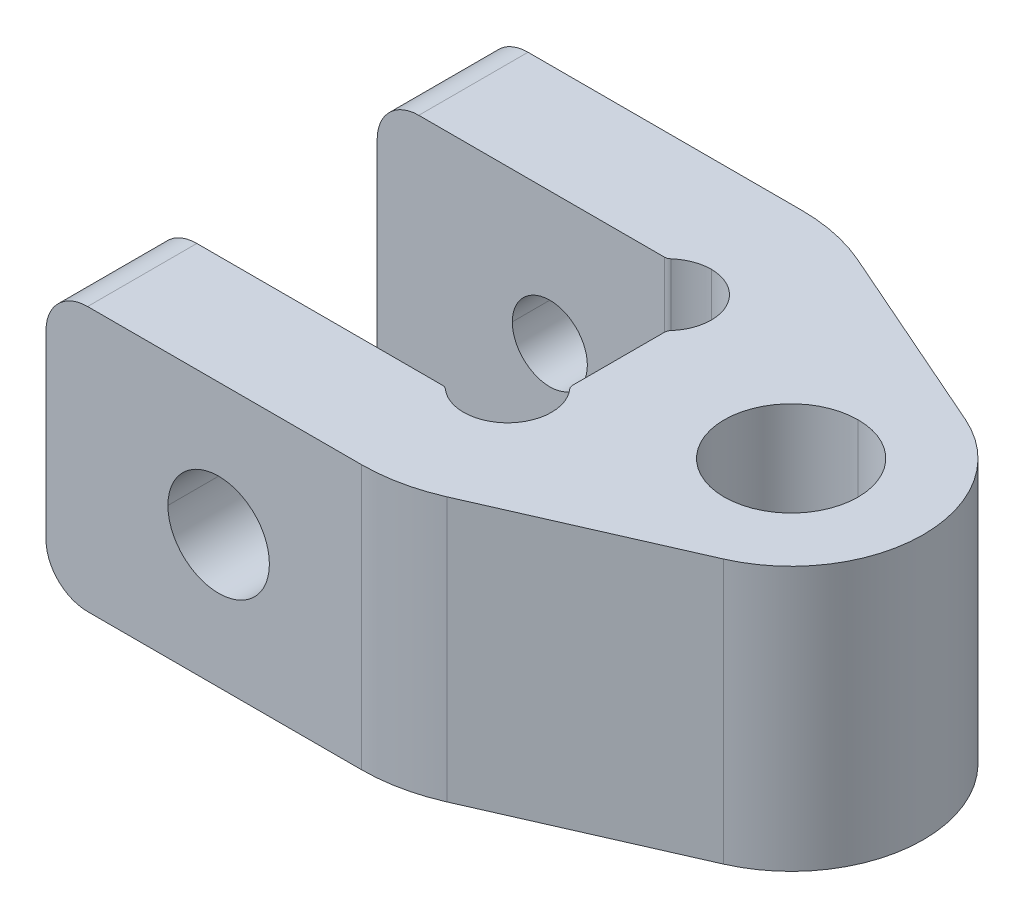
ISO-10303-21;
HEADER;
FILE_DESCRIPTION(('STEP AP214'),'2;1');
FILE_NAME('part.step','',(''),(''),'','','');
FILE_SCHEMA(('AUTOMOTIVE_DESIGN { 1 0 10303 214 1 1 1 1 }'));
ENDSEC;
DATA;
#1=APPLICATION_CONTEXT('core data for automotive mechanical design processes');
#2=APPLICATION_PROTOCOL_DEFINITION('international standard','automotive_design',2000,#1);
#3=PRODUCT_CONTEXT('',#1,'mechanical');
#4=PRODUCT('Part','Part','',(#3));
#5=PRODUCT_RELATED_PRODUCT_CATEGORY('part','',(#4));
#6=PRODUCT_DEFINITION_FORMATION('','',#4);
#7=PRODUCT_DEFINITION_CONTEXT('part definition',#1,'design');
#8=PRODUCT_DEFINITION('design','',#6,#7);
#9=PRODUCT_DEFINITION_SHAPE('','',#8);
#10=(LENGTH_UNIT() NAMED_UNIT(*) SI_UNIT(.MILLI.,.METRE.));
#11=(NAMED_UNIT(*) PLANE_ANGLE_UNIT() SI_UNIT($,.RADIAN.));
#12=(NAMED_UNIT(*) SI_UNIT($,.STERADIAN.) SOLID_ANGLE_UNIT());
#13=UNCERTAINTY_MEASURE_WITH_UNIT(LENGTH_MEASURE(1.E-05),#10,'distance_accuracy_value','');
#14=(GEOMETRIC_REPRESENTATION_CONTEXT(3) GLOBAL_UNCERTAINTY_ASSIGNED_CONTEXT((#13)) GLOBAL_UNIT_ASSIGNED_CONTEXT((#10,
#11,#12)) REPRESENTATION_CONTEXT('',''));
#15=CARTESIAN_POINT('',(0.,0.,0.));
#16=DIRECTION('',(0.,0.,1.));
#17=DIRECTION('',(1.,0.,0.));
#18=AXIS2_PLACEMENT_3D('',#15,#16,#17);
#19=CARTESIAN_POINT('',(0.,0.,-7.9385));
#20=DIRECTION('',(0.,0.,1.));
#21=DIRECTION('',(1.,0.,0.));
#22=AXIS2_PLACEMENT_3D('',#19,#20,#21);
#23=CYLINDRICAL_SURFACE('',#22,1.8288);
#24=DIRECTION('',(0.,0.,1.));
#25=VECTOR('',#24,1.);
#26=CARTESIAN_POINT('',(-1.8288,0.,-7.9385));
#27=LINE('',#26,#25);
#28=CARTESIAN_POINT('',(-1.8288,0.,4.0005));
#29=VERTEX_POINT('',#28);
#30=CARTESIAN_POINT('',(-1.8288,0.,7.9375));
#31=VERTEX_POINT('',#30);
#32=EDGE_CURVE('E319',#29,#31,#27,.T.);
#33=ORIENTED_EDGE('',*,*,#32,.F.);
#34=CARTESIAN_POINT('',(0.,0.,4.0005));
#35=DIRECTION('',(0.,0.,-1.));
#36=DIRECTION('',(1.,0.,0.));
#37=AXIS2_PLACEMENT_3D('',#34,#35,#36);
#38=CIRCLE('',#37,1.8288);
#39=CARTESIAN_POINT('',(1.8288,0.,4.0005));
#40=VERTEX_POINT('',#39);
#41=EDGE_CURVE('E282',#29,#40,#38,.T.);
#42=ORIENTED_EDGE('',*,*,#41,.T.);
#43=DIRECTION('',(0.,0.,1.));
#44=VECTOR('',#43,1.);
#45=CARTESIAN_POINT('',(1.8288,0.,-7.9385));
#46=LINE('',#45,#44);
#47=CARTESIAN_POINT('',(1.8288,0.,7.9375));
#48=VERTEX_POINT('',#47);
#49=EDGE_CURVE('E308',#40,#48,#46,.T.);
#50=ORIENTED_EDGE('',*,*,#49,.T.);
#51=CARTESIAN_POINT('',(0.,0.,7.9375));
#52=DIRECTION('',(0.,0.,1.));
#53=DIRECTION('',(1.,0.,0.));
#54=AXIS2_PLACEMENT_3D('',#51,#52,#53);
#55=CIRCLE('',#54,1.8288);
#56=EDGE_CURVE('E366',#48,#31,#55,.T.);
#57=ORIENTED_EDGE('',*,*,#56,.T.);
#58=EDGE_LOOP('',(#33,#42,#50,#57));
#59=FACE_BOUND('',#58,.T.);
#60=ADVANCED_FACE('F16',(#59),#23,.F.);
#61=CARTESIAN_POINT('',(0.,0.,-7.9375));
#62=DIRECTION('',(0.,0.,-1.));
#63=DIRECTION('',(-1.,0.,0.));
#64=AXIS2_PLACEMENT_3D('',#61,#62,#63);
#65=CYLINDRICAL_SURFACE('',#64,1.35255);
#66=DIRECTION('',(0.,0.,-1.));
#67=VECTOR('',#66,1.);
#68=CARTESIAN_POINT('',(1.35255,0.,-7.9375));
#69=LINE('',#68,#67);
#70=CARTESIAN_POINT('',(1.35255,0.,-4.0005));
#71=VERTEX_POINT('',#70);
#72=CARTESIAN_POINT('',(1.35255,0.,-7.9375));
#73=VERTEX_POINT('',#72);
#74=EDGE_CURVE('E307',#71,#73,#69,.T.);
#75=ORIENTED_EDGE('',*,*,#74,.F.);
#76=CARTESIAN_POINT('',(0.,0.,-4.0005));
#77=DIRECTION('',(0.,0.,-1.));
#78=DIRECTION('',(-1.,0.,0.));
#79=AXIS2_PLACEMENT_3D('',#76,#77,#78);
#80=CIRCLE('',#79,1.35255);
#81=CARTESIAN_POINT('',(-1.35255,0.,-4.0005));
#82=VERTEX_POINT('',#81);
#83=EDGE_CURVE('E372',#82,#71,#80,.T.);
#84=ORIENTED_EDGE('',*,*,#83,.F.);
#85=DIRECTION('',(0.,0.,-1.));
#86=VECTOR('',#85,1.);
#87=CARTESIAN_POINT('',(-1.35255,0.,-7.9375));
#88=LINE('',#87,#86);
#89=CARTESIAN_POINT('',(-1.35255,0.,-7.9375));
#90=VERTEX_POINT('',#89);
#91=EDGE_CURVE('E371',#82,#90,#88,.T.);
#92=ORIENTED_EDGE('',*,*,#91,.T.);
#93=CARTESIAN_POINT('',(0.,0.,-7.9375));
#94=DIRECTION('',(0.,0.,-1.));
#95=DIRECTION('',(-1.,0.,0.));
#96=AXIS2_PLACEMENT_3D('',#93,#94,#95);
#97=CIRCLE('',#96,1.35255);
#98=EDGE_CURVE('E351',#90,#73,#97,.T.);
#99=ORIENTED_EDGE('',*,*,#98,.T.);
#100=EDGE_LOOP('',(#75,#84,#92,#99));
#101=FACE_BOUND('',#100,.T.);
#102=ADVANCED_FACE('F18',(#101),#65,.F.);
#103=CARTESIAN_POINT('',(5.14304645171047,4.7625,-1.5875));
#104=DIRECTION('',(0.,-1.,0.));
#105=DIRECTION('',(0.,0.,-1.));
#106=AXIS2_PLACEMENT_3D('',#103,#104,#105);
#107=CYLINDRICAL_SURFACE('',#106,6.35);
#108=CARTESIAN_POINT('',(5.14304645171047,4.7625,-1.5875));
#109=DIRECTION('',(0.,1.,0.));
#110=DIRECTION('',(0.,0.,1.));
#111=AXIS2_PLACEMENT_3D('',#108,#109,#110);
#112=CIRCLE('',#111,6.35);
#113=CARTESIAN_POINT('',(7.69819484075635,4.7625,-7.40073633701197));
#114=VERTEX_POINT('',#113);
#115=CARTESIAN_POINT('',(5.14304645171047,4.7625,-7.9375));
#116=VERTEX_POINT('',#115);
#117=EDGE_CURVE('E204',#114,#116,#112,.T.);
#118=ORIENTED_EDGE('',*,*,#117,.F.);
#119=DIRECTION('',(0.,1.,0.));
#120=VECTOR('',#119,1.);
#121=CARTESIAN_POINT('',(7.69819484075634,4.7625,-7.40073633701197));
#122=LINE('',#121,#120);
#123=CARTESIAN_POINT('',(7.69819484075635,-4.7625,-7.40073633701197));
#124=VERTEX_POINT('',#123);
#125=EDGE_CURVE('E296',#124,#114,#122,.T.);
#126=ORIENTED_EDGE('',*,*,#125,.F.);
#127=CARTESIAN_POINT('',(5.14304645171047,-4.7625,-1.5875));
#128=DIRECTION('',(0.,-1.,0.));
#129=DIRECTION('',(0.,0.,1.));
#130=AXIS2_PLACEMENT_3D('',#127,#128,#129);
#131=CIRCLE('',#130,6.35);
#132=CARTESIAN_POINT('',(5.14304645171047,-4.7625,-7.9375));
#133=VERTEX_POINT('',#132);
#134=EDGE_CURVE('E11',#133,#124,#131,.T.);
#135=ORIENTED_EDGE('',*,*,#134,.F.);
#136=DIRECTION('',(0.,-1.,0.));
#137=VECTOR('',#136,1.);
#138=CARTESIAN_POINT('',(5.14304645171047,4.7625,-7.9375));
#139=LINE('',#138,#137);
#140=EDGE_CURVE('E393',#116,#133,#139,.T.);
#141=ORIENTED_EDGE('',*,*,#140,.F.);
#142=EDGE_LOOP('',(#118,#126,#135,#141));
#143=FACE_BOUND('',#142,.T.);
#144=ADVANCED_FACE('F806',(#143),#107,.T.);
#145=CARTESIAN_POINT('',(5.14304645171047,4.7625,1.5875));
#146=DIRECTION('',(0.,-1.,0.));
#147=DIRECTION('',(0.,0.,-1.));
#148=AXIS2_PLACEMENT_3D('',#145,#146,#147);
#149=CYLINDRICAL_SURFACE('',#148,6.35);
#150=CARTESIAN_POINT('',(5.14304645171047,4.7625,1.5875));
#151=DIRECTION('',(0.,1.,0.));
#152=DIRECTION('',(0.,0.,1.));
#153=AXIS2_PLACEMENT_3D('',#150,#151,#152);
#154=CIRCLE('',#153,6.35);
#155=CARTESIAN_POINT('',(5.14304645171047,4.7625,7.9375));
#156=VERTEX_POINT('',#155);
#157=CARTESIAN_POINT('',(7.69819484075634,4.7625,7.40073633701197));
#158=VERTEX_POINT('',#157);
#159=EDGE_CURVE('E421',#156,#158,#154,.T.);
#160=ORIENTED_EDGE('',*,*,#159,.F.);
#161=DIRECTION('',(0.,1.,0.));
#162=VECTOR('',#161,1.);
#163=CARTESIAN_POINT('',(5.14304645171047,4.7625,7.9375));
#164=LINE('',#163,#162);
#165=CARTESIAN_POINT('',(5.14304645171047,-4.7625,7.9375));
#166=VERTEX_POINT('',#165);
#167=EDGE_CURVE('E235',#166,#156,#164,.T.);
#168=ORIENTED_EDGE('',*,*,#167,.F.);
#169=CARTESIAN_POINT('',(5.14304645171047,-4.7625,1.5875));
#170=DIRECTION('',(0.,-1.,0.));
#171=DIRECTION('',(0.,0.,1.));
#172=AXIS2_PLACEMENT_3D('',#169,#170,#171);
#173=CIRCLE('',#172,6.35);
#174=CARTESIAN_POINT('',(7.69819484075634,-4.7625,7.40073633701197));
#175=VERTEX_POINT('',#174);
#176=EDGE_CURVE('E337',#175,#166,#173,.T.);
#177=ORIENTED_EDGE('',*,*,#176,.F.);
#178=DIRECTION('',(0.,-1.,0.));
#179=VECTOR('',#178,1.);
#180=CARTESIAN_POINT('',(7.69819484075634,4.7625,7.40073633701197));
#181=LINE('',#180,#179);
#182=EDGE_CURVE('E365',#158,#175,#181,.T.);
#183=ORIENTED_EDGE('',*,*,#182,.F.);
#184=EDGE_LOOP('',(#160,#168,#177,#183));
#185=FACE_BOUND('',#184,.T.);
#186=ADVANCED_FACE('F908',(#185),#149,.T.);
#187=CARTESIAN_POINT('',(6.727,4.7625,-1.65626338987083));
#188=DIRECTION('',(0.,-1.,0.));
#189=DIRECTION('',(0.,0.,-1.));
#190=AXIS2_PLACEMENT_3D('',#187,#188,#189);
#191=CYLINDRICAL_SURFACE('',#190,0.25);
#192=CARTESIAN_POINT('',(6.727,4.7625,-1.65626338987083));
#193=DIRECTION('',(0.,1.,0.));
#194=DIRECTION('',(0.,0.,1.));
#195=AXIS2_PLACEMENT_3D('',#192,#193,#194);
#196=CIRCLE('',#195,0.25);
#197=CARTESIAN_POINT('',(6.54026095032195,4.7625,-1.82248170211512));
#198=VERTEX_POINT('',#197);
#199=CARTESIAN_POINT('',(6.477,4.7625,-1.65626338987083));
#200=VERTEX_POINT('',#199);
#201=EDGE_CURVE('E42',#198,#200,#196,.T.);
#202=ORIENTED_EDGE('',*,*,#201,.F.);
#203=DIRECTION('',(0.,1.,0.));
#204=VECTOR('',#203,1.);
#205=CARTESIAN_POINT('',(6.54026095032195,4.7625,-1.82248170211512));
#206=LINE('',#205,#204);
#207=CARTESIAN_POINT('',(6.54026095032195,-4.7625,-1.82248170211512));
#208=VERTEX_POINT('',#207);
#209=EDGE_CURVE('E396',#208,#198,#206,.T.);
#210=ORIENTED_EDGE('',*,*,#209,.F.);
#211=CARTESIAN_POINT('',(6.727,-4.7625,-1.65626338987083));
#212=DIRECTION('',(0.,-1.,0.));
#213=DIRECTION('',(0.,0.,1.));
#214=AXIS2_PLACEMENT_3D('',#211,#212,#213);
#215=CIRCLE('',#214,0.25);
#216=CARTESIAN_POINT('',(6.477,-4.7625,-1.65626338987083));
#217=VERTEX_POINT('',#216);
#218=EDGE_CURVE('E292',#217,#208,#215,.T.);
#219=ORIENTED_EDGE('',*,*,#218,.F.);
#220=DIRECTION('',(0.,-1.,0.));
#221=VECTOR('',#220,1.);
#222=CARTESIAN_POINT('',(6.477,-4.7625,-1.65626338987083));
#223=LINE('',#222,#221);
#224=EDGE_CURVE('E356',#200,#217,#223,.T.);
#225=ORIENTED_EDGE('',*,*,#224,.F.);
#226=EDGE_LOOP('',(#202,#210,#219,#225));
#227=FACE_BOUND('',#226,.T.);
#228=ADVANCED_FACE('F845',(#227),#191,.T.);
#229=CARTESIAN_POINT('',(6.727,4.7625,1.65626338987083));
#230=DIRECTION('',(0.,-1.,0.));
#231=DIRECTION('',(0.,0.,-1.));
#232=AXIS2_PLACEMENT_3D('',#229,#230,#231);
#233=CYLINDRICAL_SURFACE('',#232,0.25);
#234=CARTESIAN_POINT('',(6.727,4.7625,1.65626338987083));
#235=DIRECTION('',(0.,1.,0.));
#236=DIRECTION('',(0.,0.,1.));
#237=AXIS2_PLACEMENT_3D('',#234,#235,#236);
#238=CIRCLE('',#237,0.25);
#239=CARTESIAN_POINT('',(6.477,4.7625,1.65626338987083));
#240=VERTEX_POINT('',#239);
#241=CARTESIAN_POINT('',(6.54026095032195,4.7625,1.82248170211512));
#242=VERTEX_POINT('',#241);
#243=EDGE_CURVE('E284',#240,#242,#238,.T.);
#244=ORIENTED_EDGE('',*,*,#243,.F.);
#245=DIRECTION('',(0.,1.,0.));
#246=VECTOR('',#245,1.);
#247=CARTESIAN_POINT('',(6.477,4.7625,1.65626338987083));
#248=LINE('',#247,#246);
#249=CARTESIAN_POINT('',(6.477,-4.7625,1.65626338987083));
#250=VERTEX_POINT('',#249);
#251=EDGE_CURVE('E330',#250,#240,#248,.T.);
#252=ORIENTED_EDGE('',*,*,#251,.F.);
#253=CARTESIAN_POINT('',(6.727,-4.7625,1.65626338987083));
#254=DIRECTION('',(0.,-1.,0.));
#255=DIRECTION('',(0.,0.,1.));
#256=AXIS2_PLACEMENT_3D('',#253,#254,#255);
#257=CIRCLE('',#256,0.25);
#258=CARTESIAN_POINT('',(6.54026095032195,-4.7625,1.82248170211512));
#259=VERTEX_POINT('',#258);
#260=EDGE_CURVE('E328',#259,#250,#257,.T.);
#261=ORIENTED_EDGE('',*,*,#260,.F.);
#262=DIRECTION('',(0.,-1.,0.));
#263=VECTOR('',#262,1.);
#264=CARTESIAN_POINT('',(6.54026095032195,4.7625,1.82248170211512));
#265=LINE('',#264,#263);
#266=EDGE_CURVE('E379',#242,#259,#265,.T.);
#267=ORIENTED_EDGE('',*,*,#266,.F.);
#268=EDGE_LOOP('',(#244,#252,#261,#267));
#269=FACE_BOUND('',#268,.T.);
#270=ADVANCED_FACE('F842',(#269),#233,.T.);
#271=CARTESIAN_POINT('',(4.13276338987083,4.7625,-4.2505));
#272=DIRECTION('',(0.,-1.,0.));
#273=DIRECTION('',(0.,0.,-1.));
#274=AXIS2_PLACEMENT_3D('',#271,#272,#273);
#275=CYLINDRICAL_SURFACE('',#274,0.25);
#276=CARTESIAN_POINT('',(4.13276338987083,4.7625,-4.2505));
#277=DIRECTION('',(0.,1.,0.));
#278=DIRECTION('',(0.,0.,1.));
#279=AXIS2_PLACEMENT_3D('',#276,#277,#278);
#280=CIRCLE('',#279,0.25);
#281=CARTESIAN_POINT('',(4.13276338987083,4.7625,-4.0005));
#282=VERTEX_POINT('',#281);
#283=CARTESIAN_POINT('',(4.29898170211512,4.7625,-4.06376095032196));
#284=VERTEX_POINT('',#283);
#285=EDGE_CURVE('E180',#282,#284,#280,.T.);
#286=ORIENTED_EDGE('',*,*,#285,.F.);
#287=DIRECTION('',(0.,1.,0.));
#288=VECTOR('',#287,1.);
#289=CARTESIAN_POINT('',(4.13276338987083,4.7625,-4.0005));
#290=LINE('',#289,#288);
#291=CARTESIAN_POINT('',(4.13276338987083,-4.7625,-4.0005));
#292=VERTEX_POINT('',#291);
#293=EDGE_CURVE('E218',#292,#282,#290,.T.);
#294=ORIENTED_EDGE('',*,*,#293,.F.);
#295=CARTESIAN_POINT('',(4.13276338987083,-4.7625,-4.2505));
#296=DIRECTION('',(0.,-1.,0.));
#297=DIRECTION('',(0.,0.,1.));
#298=AXIS2_PLACEMENT_3D('',#295,#296,#297);
#299=CIRCLE('',#298,0.25);
#300=CARTESIAN_POINT('',(4.29898170211512,-4.7625,-4.06376095032196));
#301=VERTEX_POINT('',#300);
#302=EDGE_CURVE('E288',#301,#292,#299,.T.);
#303=ORIENTED_EDGE('',*,*,#302,.F.);
#304=DIRECTION('',(0.,-1.,0.));
#305=VECTOR('',#304,1.);
#306=CARTESIAN_POINT('',(4.29898170211512,4.7625,-4.06376095032195));
#307=LINE('',#306,#305);
#308=EDGE_CURVE('E248',#284,#301,#307,.T.);
#309=ORIENTED_EDGE('',*,*,#308,.F.);
#310=EDGE_LOOP('',(#286,#294,#303,#309));
#311=FACE_BOUND('',#310,.T.);
#312=ADVANCED_FACE('F844',(#311),#275,.T.);
#313=CARTESIAN_POINT('',(4.13276338987083,4.7625,4.2505));
#314=DIRECTION('',(0.,-1.,0.));
#315=DIRECTION('',(0.,0.,-1.));
#316=AXIS2_PLACEMENT_3D('',#313,#314,#315);
#317=CYLINDRICAL_SURFACE('',#316,0.25);
#318=CARTESIAN_POINT('',(4.13276338987083,4.7625,4.2505));
#319=DIRECTION('',(0.,1.,0.));
#320=DIRECTION('',(0.,0.,1.));
#321=AXIS2_PLACEMENT_3D('',#318,#319,#320);
#322=CIRCLE('',#321,0.25);
#323=CARTESIAN_POINT('',(4.29898170211512,4.7625,4.06376095032196));
#324=VERTEX_POINT('',#323);
#325=CARTESIAN_POINT('',(4.13276338987083,4.7625,4.0005));
#326=VERTEX_POINT('',#325);
#327=EDGE_CURVE('E287',#324,#326,#322,.T.);
#328=ORIENTED_EDGE('',*,*,#327,.F.);
#329=DIRECTION('',(0.,1.,0.));
#330=VECTOR('',#329,1.);
#331=CARTESIAN_POINT('',(4.29898170211512,4.7625,4.06376095032196));
#332=LINE('',#331,#330);
#333=CARTESIAN_POINT('',(4.29898170211512,-4.7625,4.06376095032196));
#334=VERTEX_POINT('',#333);
#335=EDGE_CURVE('E413',#334,#324,#332,.T.);
#336=ORIENTED_EDGE('',*,*,#335,.F.);
#337=CARTESIAN_POINT('',(4.13276338987083,-4.7625,4.2505));
#338=DIRECTION('',(0.,-1.,0.));
#339=DIRECTION('',(0.,0.,1.));
#340=AXIS2_PLACEMENT_3D('',#337,#338,#339);
#341=CIRCLE('',#340,0.25);
#342=CARTESIAN_POINT('',(4.13276338987083,-4.7625,4.0005));
#343=VERTEX_POINT('',#342);
#344=EDGE_CURVE('E325',#343,#334,#341,.T.);
#345=ORIENTED_EDGE('',*,*,#344,.F.);
#346=DIRECTION('',(0.,-1.,0.));
#347=VECTOR('',#346,1.);
#348=CARTESIAN_POINT('',(4.13276338987083,-4.7625,4.0005));
#349=LINE('',#348,#347);
#350=EDGE_CURVE('E260',#326,#343,#349,.T.);
#351=ORIENTED_EDGE('',*,*,#350,.F.);
#352=EDGE_LOOP('',(#328,#336,#345,#351));
#353=FACE_BOUND('',#352,.T.);
#354=ADVANCED_FACE('F884',(#353),#317,.T.);
#355=CARTESIAN_POINT('',(-4.723,3.2625,0.));
#356=DIRECTION('',(0.,0.,-1.));
#357=DIRECTION('',(-1.,0.,0.));
#358=AXIS2_PLACEMENT_3D('',#355,#356,#357);
#359=CYLINDRICAL_SURFACE('',#358,1.5);
#360=CARTESIAN_POINT('',(-4.723,3.2625,-7.9375));
#361=DIRECTION('',(0.,0.,-1.));
#362=DIRECTION('',(1.,0.,0.));
#363=AXIS2_PLACEMENT_3D('',#360,#361,#362);
#364=CIRCLE('',#363,1.5);
#365=CARTESIAN_POINT('',(-6.223,3.2625,-7.9375));
#366=VERTEX_POINT('',#365);
#367=CARTESIAN_POINT('',(-4.723,4.7625,-7.9375));
#368=VERTEX_POINT('',#367);
#369=EDGE_CURVE('E355',#366,#368,#364,.T.);
#370=ORIENTED_EDGE('',*,*,#369,.F.);
#371=DIRECTION('',(0.,0.,-1.));
#372=VECTOR('',#371,1.);
#373=CARTESIAN_POINT('',(-6.223,3.2625,-7.9375));
#374=LINE('',#373,#372);
#375=CARTESIAN_POINT('',(-6.223,3.2625,-4.0005));
#376=VERTEX_POINT('',#375);
#377=EDGE_CURVE('E209',#376,#366,#374,.T.);
#378=ORIENTED_EDGE('',*,*,#377,.F.);
#379=CARTESIAN_POINT('',(-4.723,3.2625,-4.0005));
#380=DIRECTION('',(0.,0.,1.));
#381=DIRECTION('',(-1.,0.,0.));
#382=AXIS2_PLACEMENT_3D('',#379,#380,#381);
#383=CIRCLE('',#382,1.5);
#384=CARTESIAN_POINT('',(-4.723,4.7625,-4.0005));
#385=VERTEX_POINT('',#384);
#386=EDGE_CURVE('E207',#385,#376,#383,.T.);
#387=ORIENTED_EDGE('',*,*,#386,.F.);
#388=DIRECTION('',(0.,0.,1.));
#389=VECTOR('',#388,1.);
#390=CARTESIAN_POINT('',(-4.723,4.7625,-4.0005));
#391=LINE('',#390,#389);
#392=EDGE_CURVE('E190',#368,#385,#391,.T.);
#393=ORIENTED_EDGE('',*,*,#392,.F.);
#394=EDGE_LOOP('',(#370,#378,#387,#393));
#395=FACE_BOUND('',#394,.T.);
#396=ADVANCED_FACE('F208',(#395),#359,.T.);
#397=CARTESIAN_POINT('',(-4.723,-3.2625,0.));
#398=DIRECTION('',(0.,0.,1.));
#399=DIRECTION('',(1.,0.,0.));
#400=AXIS2_PLACEMENT_3D('',#397,#398,#399);
#401=CYLINDRICAL_SURFACE('',#400,1.5);
#402=CARTESIAN_POINT('',(-4.723,-3.2625,-7.9375));
#403=DIRECTION('',(0.,0.,-1.));
#404=DIRECTION('',(1.,0.,0.));
#405=AXIS2_PLACEMENT_3D('',#402,#403,#404);
#406=CIRCLE('',#405,1.5);
#407=CARTESIAN_POINT('',(-4.723,-4.7625,-7.9375));
#408=VERTEX_POINT('',#407);
#409=CARTESIAN_POINT('',(-6.223,-3.2625,-7.9375));
#410=VERTEX_POINT('',#409);
#411=EDGE_CURVE('E392',#408,#410,#406,.T.);
#412=ORIENTED_EDGE('',*,*,#411,.F.);
#413=DIRECTION('',(0.,0.,-1.));
#414=VECTOR('',#413,1.);
#415=CARTESIAN_POINT('',(-4.723,-4.7625,0.));
#416=LINE('',#415,#414);
#417=CARTESIAN_POINT('',(-4.723,-4.7625,-4.0005));
#418=VERTEX_POINT('',#417);
#419=EDGE_CURVE('E27',#418,#408,#416,.T.);
#420=ORIENTED_EDGE('',*,*,#419,.F.);
#421=CARTESIAN_POINT('',(-4.723,-3.2625,-4.0005));
#422=DIRECTION('',(0.,0.,1.));
#423=DIRECTION('',(-1.,0.,0.));
#424=AXIS2_PLACEMENT_3D('',#421,#422,#423);
#425=CIRCLE('',#424,1.5);
#426=CARTESIAN_POINT('',(-6.223,-3.2625,-4.0005));
#427=VERTEX_POINT('',#426);
#428=EDGE_CURVE('E20',#427,#418,#425,.T.);
#429=ORIENTED_EDGE('',*,*,#428,.F.);
#430=DIRECTION('',(0.,0.,1.));
#431=VECTOR('',#430,1.);
#432=CARTESIAN_POINT('',(-6.223,-3.2625,0.));
#433=LINE('',#432,#431);
#434=EDGE_CURVE('E242',#410,#427,#433,.T.);
#435=ORIENTED_EDGE('',*,*,#434,.F.);
#436=EDGE_LOOP('',(#412,#420,#429,#435));
#437=FACE_BOUND('',#436,.T.);
#438=ADVANCED_FACE('F810',(#437),#401,.T.);
#439=CARTESIAN_POINT('',(-4.723,3.2625,0.));
#440=DIRECTION('',(0.,0.,-1.));
#441=DIRECTION('',(-1.,0.,0.));
#442=AXIS2_PLACEMENT_3D('',#439,#440,#441);
#443=CYLINDRICAL_SURFACE('',#442,1.5);
#444=CARTESIAN_POINT('',(-4.723,3.2625,4.0005));
#445=DIRECTION('',(0.,0.,-1.));
#446=DIRECTION('',(1.,0.,0.));
#447=AXIS2_PLACEMENT_3D('',#444,#445,#446);
#448=CIRCLE('',#447,1.5);
#449=CARTESIAN_POINT('',(-6.223,3.2625,4.0005));
#450=VERTEX_POINT('',#449);
#451=CARTESIAN_POINT('',(-4.723,4.7625,4.0005));
#452=VERTEX_POINT('',#451);
#453=EDGE_CURVE('E278',#450,#452,#448,.T.);
#454=ORIENTED_EDGE('',*,*,#453,.F.);
#455=DIRECTION('',(0.,0.,-1.));
#456=VECTOR('',#455,1.);
#457=CARTESIAN_POINT('',(-6.223,3.2625,4.0005));
#458=LINE('',#457,#456);
#459=CARTESIAN_POINT('',(-6.223,3.2625,7.9375));
#460=VERTEX_POINT('',#459);
#461=EDGE_CURVE('E236',#460,#450,#458,.T.);
#462=ORIENTED_EDGE('',*,*,#461,.F.);
#463=CARTESIAN_POINT('',(-4.723,3.2625,7.9375));
#464=DIRECTION('',(0.,0.,1.));
#465=DIRECTION('',(-1.,0.,0.));
#466=AXIS2_PLACEMENT_3D('',#463,#464,#465);
#467=CIRCLE('',#466,1.5);
#468=CARTESIAN_POINT('',(-4.723,4.7625,7.9375));
#469=VERTEX_POINT('',#468);
#470=EDGE_CURVE('E343',#469,#460,#467,.T.);
#471=ORIENTED_EDGE('',*,*,#470,.F.);
#472=DIRECTION('',(0.,0.,1.));
#473=VECTOR('',#472,1.);
#474=CARTESIAN_POINT('',(-4.723,4.7625,7.9375));
#475=LINE('',#474,#473);
#476=EDGE_CURVE('E433',#452,#469,#475,.T.);
#477=ORIENTED_EDGE('',*,*,#476,.F.);
#478=EDGE_LOOP('',(#454,#462,#471,#477));
#479=FACE_BOUND('',#478,.T.);
#480=ADVANCED_FACE('F609',(#479),#443,.T.);
#481=CARTESIAN_POINT('',(-4.723,-3.2625,0.));
#482=DIRECTION('',(0.,0.,1.));
#483=DIRECTION('',(1.,0.,0.));
#484=AXIS2_PLACEMENT_3D('',#481,#482,#483);
#485=CYLINDRICAL_SURFACE('',#484,1.5);
#486=CARTESIAN_POINT('',(-4.723,-3.2625,4.0005));
#487=DIRECTION('',(0.,0.,-1.));
#488=DIRECTION('',(1.,0.,0.));
#489=AXIS2_PLACEMENT_3D('',#486,#487,#488);
#490=CIRCLE('',#489,1.5);
#491=CARTESIAN_POINT('',(-4.723,-4.7625,4.0005));
#492=VERTEX_POINT('',#491);
#493=CARTESIAN_POINT('',(-6.223,-3.2625,4.0005));
#494=VERTEX_POINT('',#493);
#495=EDGE_CURVE('E384',#492,#494,#490,.T.);
#496=ORIENTED_EDGE('',*,*,#495,.F.);
#497=DIRECTION('',(0.,0.,-1.));
#498=VECTOR('',#497,1.);
#499=CARTESIAN_POINT('',(-4.723,-4.7625,0.));
#500=LINE('',#499,#498);
#501=CARTESIAN_POINT('',(-4.723,-4.7625,7.9375));
#502=VERTEX_POINT('',#501);
#503=EDGE_CURVE('E329',#502,#492,#500,.T.);
#504=ORIENTED_EDGE('',*,*,#503,.F.);
#505=CARTESIAN_POINT('',(-4.723,-3.2625,7.9375));
#506=DIRECTION('',(0.,0.,1.));
#507=DIRECTION('',(-1.,0.,0.));
#508=AXIS2_PLACEMENT_3D('',#505,#506,#507);
#509=CIRCLE('',#508,1.5);
#510=CARTESIAN_POINT('',(-6.223,-3.2625,7.9375));
#511=VERTEX_POINT('',#510);
#512=EDGE_CURVE('E418',#511,#502,#509,.T.);
#513=ORIENTED_EDGE('',*,*,#512,.F.);
#514=DIRECTION('',(0.,0.,1.));
#515=VECTOR('',#514,1.);
#516=CARTESIAN_POINT('',(-6.223,-3.2625,0.));
#517=LINE('',#516,#515);
#518=EDGE_CURVE('E241',#494,#511,#517,.T.);
#519=ORIENTED_EDGE('',*,*,#518,.F.);
#520=EDGE_LOOP('',(#496,#504,#513,#519));
#521=FACE_BOUND('',#520,.T.);
#522=ADVANCED_FACE('F617',(#521),#485,.T.);
#523=CARTESIAN_POINT('',(0.,-4.7625,0.));
#524=DIRECTION('',(0.,1.,0.));
#525=DIRECTION('',(1.,0.,0.));
#526=AXIS2_PLACEMENT_3D('',#523,#524,#525);
#527=PLANE('',#526);
#528=CARTESIAN_POINT('',(12.7,-4.7625,0.));
#529=DIRECTION('',(0.,1.,0.));
#530=DIRECTION('',(0.,0.,1.));
#531=AXIS2_PLACEMENT_3D('',#528,#529,#530);
#532=CIRCLE('',#531,2.413);
#533=CARTESIAN_POINT('',(12.7,-4.7625,-2.413));
#534=VERTEX_POINT('',#533);
#535=CARTESIAN_POINT('',(12.7,-4.7625,2.413));
#536=VERTEX_POINT('',#535);
#537=EDGE_CURVE('E254',#534,#536,#532,.T.);
#538=ORIENTED_EDGE('',*,*,#537,.T.);
#539=CARTESIAN_POINT('',(12.7,-4.7625,0.));
#540=DIRECTION('',(0.,1.,0.));
#541=DIRECTION('',(0.,0.,1.));
#542=AXIS2_PLACEMENT_3D('',#539,#540,#541);
#543=CIRCLE('',#542,2.413);
#544=EDGE_CURVE('E383',#536,#534,#543,.T.);
#545=ORIENTED_EDGE('',*,*,#544,.T.);
#546=EDGE_LOOP('',(#538,#545));
#547=FACE_BOUND('',#546,.T.);
#548=DIRECTION('',(0.915470289293222,0.,-0.402385573078091));
#549=VECTOR('',#548,1.);
#550=CARTESIAN_POINT('',(3.97267098943597,-4.7625,9.03825212257285));
#551=LINE('',#550,#549);
#552=CARTESIAN_POINT('',(14.6163612917844,-4.7625,4.35992725275897));
#553=VERTEX_POINT('',#552);
#554=EDGE_CURVE('E271',#175,#553,#551,.T.);
#555=ORIENTED_EDGE('',*,*,#554,.F.);
#556=ORIENTED_EDGE('',*,*,#176,.T.);
#557=DIRECTION('',(1.,0.,0.));
#558=VECTOR('',#557,1.);
#559=CARTESIAN_POINT('',(0.,-4.7625,7.9375));
#560=LINE('',#559,#558);
#561=EDGE_CURVE('E232',#502,#166,#560,.T.);
#562=ORIENTED_EDGE('',*,*,#561,.F.);
#563=ORIENTED_EDGE('',*,*,#503,.T.);
#564=DIRECTION('',(-1.,0.,0.));
#565=VECTOR('',#564,1.);
#566=CARTESIAN_POINT('',(0.,-4.7625,4.0005));
#567=LINE('',#566,#565);
#568=EDGE_CURVE('E264',#343,#492,#567,.T.);
#569=ORIENTED_EDGE('',*,*,#568,.F.);
#570=ORIENTED_EDGE('',*,*,#344,.T.);
#571=CARTESIAN_POINT('',(5.35446798486636,-4.7625,2.87796798486636));
#572=DIRECTION('',(0.,1.,0.));
#573=DIRECTION('',(0.,0.,1.));
#574=AXIS2_PLACEMENT_3D('',#571,#572,#573);
#575=CIRCLE('',#574,1.5875);
#576=EDGE_CURVE('E230',#334,#259,#575,.T.);
#577=ORIENTED_EDGE('',*,*,#576,.T.);
#578=ORIENTED_EDGE('',*,*,#260,.T.);
#579=DIRECTION('',(0.,0.,1.));
#580=VECTOR('',#579,1.);
#581=CARTESIAN_POINT('',(6.477,-4.7625,0.));
#582=LINE('',#581,#580);
#583=EDGE_CURVE('E312',#217,#250,#582,.T.);
#584=ORIENTED_EDGE('',*,*,#583,.F.);
#585=ORIENTED_EDGE('',*,*,#218,.T.);
#586=CARTESIAN_POINT('',(5.35446798486636,-4.7625,-2.87796798486636));
#587=DIRECTION('',(0.,1.,0.));
#588=DIRECTION('',(0.,0.,1.));
#589=AXIS2_PLACEMENT_3D('',#586,#587,#588);
#590=CIRCLE('',#589,1.5875);
#591=CARTESIAN_POINT('',(5.35446798486636,-4.7625,-4.46546798486635));
#592=VERTEX_POINT('',#591);
#593=EDGE_CURVE('E348',#208,#592,#590,.T.);
#594=ORIENTED_EDGE('',*,*,#593,.T.);
#595=CARTESIAN_POINT('',(5.35446798486636,-4.7625,-2.87796798486636));
#596=DIRECTION('',(0.,1.,0.));
#597=DIRECTION('',(0.,0.,1.));
#598=AXIS2_PLACEMENT_3D('',#595,#596,#597);
#599=CIRCLE('',#598,1.5875);
#600=EDGE_CURVE('E252',#592,#301,#599,.T.);
#601=ORIENTED_EDGE('',*,*,#600,.T.);
#602=ORIENTED_EDGE('',*,*,#302,.T.);
#603=DIRECTION('',(1.,0.,0.));
#604=VECTOR('',#603,1.);
#605=CARTESIAN_POINT('',(0.,-4.7625,-4.0005));
#606=LINE('',#605,#604);
#607=EDGE_CURVE('E226',#418,#292,#606,.T.);
#608=ORIENTED_EDGE('',*,*,#607,.F.);
#609=ORIENTED_EDGE('',*,*,#419,.T.);
#610=DIRECTION('',(-1.,0.,0.));
#611=VECTOR('',#610,1.);
#612=CARTESIAN_POINT('',(0.,-4.7625,-7.9375));
#613=LINE('',#612,#611);
#614=EDGE_CURVE('E388',#133,#408,#613,.T.);
#615=ORIENTED_EDGE('',*,*,#614,.F.);
#616=ORIENTED_EDGE('',*,*,#134,.T.);
#617=DIRECTION('',(-0.915470289293223,0.,-0.40238557307809));
#618=VECTOR('',#617,1.);
#619=CARTESIAN_POINT('',(3.97267098943597,-4.7625,-9.03825212257285));
#620=LINE('',#619,#618);
#621=CARTESIAN_POINT('',(14.6163612917844,-4.7625,-4.35992725275898));
#622=VERTEX_POINT('',#621);
#623=EDGE_CURVE('E276',#622,#124,#620,.T.);
#624=ORIENTED_EDGE('',*,*,#623,.F.);
#625=CARTESIAN_POINT('',(12.7,-4.7625,0.));
#626=DIRECTION('',(0.,1.,0.));
#627=DIRECTION('',(0.,0.,1.));
#628=AXIS2_PLACEMENT_3D('',#625,#626,#627);
#629=CIRCLE('',#628,4.7625);
#630=EDGE_CURVE('E270',#553,#622,#629,.T.);
#631=ORIENTED_EDGE('',*,*,#630,.F.);
#632=EDGE_LOOP('',(#555,#556,#562,#563,#569,#570,#577,#578,#584,#585,#594,#601,#602,#608,#609,
#615,#616,#624,#631));
#633=FACE_BOUND('',#632,.T.);
#634=ADVANCED_FACE('F875',(#547,#633),#527,.F.);
#635=CARTESIAN_POINT('',(0.,4.7625,0.));
#636=DIRECTION('',(0.,1.,0.));
#637=DIRECTION('',(1.,0.,0.));
#638=AXIS2_PLACEMENT_3D('',#635,#636,#637);
#639=PLANE('',#638);
#640=CARTESIAN_POINT('',(12.7,4.7625,0.));
#641=DIRECTION('',(0.,1.,0.));
#642=DIRECTION('',(0.,0.,1.));
#643=AXIS2_PLACEMENT_3D('',#640,#641,#642);
#644=CIRCLE('',#643,2.413);
#645=CARTESIAN_POINT('',(12.7,4.7625,-2.413));
#646=VERTEX_POINT('',#645);
#647=CARTESIAN_POINT('',(12.7,4.7625,2.413));
#648=VERTEX_POINT('',#647);
#649=EDGE_CURVE('E302',#646,#648,#644,.T.);
#650=ORIENTED_EDGE('',*,*,#649,.F.);
#651=CARTESIAN_POINT('',(12.7,4.7625,0.));
#652=DIRECTION('',(0.,1.,0.));
#653=DIRECTION('',(0.,0.,1.));
#654=AXIS2_PLACEMENT_3D('',#651,#652,#653);
#655=CIRCLE('',#654,2.413);
#656=EDGE_CURVE('E360',#648,#646,#655,.T.);
#657=ORIENTED_EDGE('',*,*,#656,.F.);
#658=EDGE_LOOP('',(#650,#657));
#659=FACE_BOUND('',#658,.T.);
#660=DIRECTION('',(1.,0.,0.));
#661=VECTOR('',#660,1.);
#662=CARTESIAN_POINT('',(0.,4.7625,7.9375));
#663=LINE('',#662,#661);
#664=EDGE_CURVE('E340',#469,#156,#663,.T.);
#665=ORIENTED_EDGE('',*,*,#664,.T.);
#666=ORIENTED_EDGE('',*,*,#159,.T.);
#667=DIRECTION('',(0.915470289293222,0.,-0.402385573078091));
#668=VECTOR('',#667,1.);
#669=CARTESIAN_POINT('',(3.97267098943597,4.7625,9.03825212257285));
#670=LINE('',#669,#668);
#671=CARTESIAN_POINT('',(14.6163612917844,4.7625,4.35992725275897));
#672=VERTEX_POINT('',#671);
#673=EDGE_CURVE('E361',#158,#672,#670,.T.);
#674=ORIENTED_EDGE('',*,*,#673,.T.);
#675=CARTESIAN_POINT('',(12.7,4.7625,0.));
#676=DIRECTION('',(0.,1.,0.));
#677=DIRECTION('',(0.,0.,1.));
#678=AXIS2_PLACEMENT_3D('',#675,#676,#677);
#679=CIRCLE('',#678,4.7625);
#680=CARTESIAN_POINT('',(14.6163612917844,4.7625,-4.35992725275898));
#681=VERTEX_POINT('',#680);
#682=EDGE_CURVE('E272',#672,#681,#679,.T.);
#683=ORIENTED_EDGE('',*,*,#682,.T.);
#684=DIRECTION('',(-0.915470289293223,0.,-0.40238557307809));
#685=VECTOR('',#684,1.);
#686=CARTESIAN_POINT('',(3.97267098943597,4.7625,-9.03825212257285));
#687=LINE('',#686,#685);
#688=EDGE_CURVE('E247',#681,#114,#687,.T.);
#689=ORIENTED_EDGE('',*,*,#688,.T.);
#690=ORIENTED_EDGE('',*,*,#117,.T.);
#691=DIRECTION('',(-1.,0.,0.));
#692=VECTOR('',#691,1.);
#693=CARTESIAN_POINT('',(0.,4.7625,-7.9375));
#694=LINE('',#693,#692);
#695=EDGE_CURVE('E199',#116,#368,#694,.T.);
#696=ORIENTED_EDGE('',*,*,#695,.T.);
#697=ORIENTED_EDGE('',*,*,#392,.T.);
#698=DIRECTION('',(1.,0.,0.));
#699=VECTOR('',#698,1.);
#700=CARTESIAN_POINT('',(0.,4.7625,-4.0005));
#701=LINE('',#700,#699);
#702=EDGE_CURVE('E195',#385,#282,#701,.T.);
#703=ORIENTED_EDGE('',*,*,#702,.T.);
#704=ORIENTED_EDGE('',*,*,#285,.T.);
#705=CARTESIAN_POINT('',(5.35446798486636,4.7625,-2.87796798486636));
#706=DIRECTION('',(0.,1.,0.));
#707=DIRECTION('',(0.,0.,1.));
#708=AXIS2_PLACEMENT_3D('',#705,#706,#707);
#709=CIRCLE('',#708,1.5875);
#710=CARTESIAN_POINT('',(5.35446798486636,4.7625,-4.46546798486635));
#711=VERTEX_POINT('',#710);
#712=EDGE_CURVE('E253',#711,#284,#709,.T.);
#713=ORIENTED_EDGE('',*,*,#712,.F.);
#714=CARTESIAN_POINT('',(5.35446798486636,4.7625,-2.87796798486636));
#715=DIRECTION('',(0.,1.,0.));
#716=DIRECTION('',(0.,0.,1.));
#717=AXIS2_PLACEMENT_3D('',#714,#715,#716);
#718=CIRCLE('',#717,1.5875);
#719=EDGE_CURVE('E316',#198,#711,#718,.T.);
#720=ORIENTED_EDGE('',*,*,#719,.F.);
#721=ORIENTED_EDGE('',*,*,#201,.T.);
#722=DIRECTION('',(0.,0.,1.));
#723=VECTOR('',#722,1.);
#724=CARTESIAN_POINT('',(6.477,4.7625,0.));
#725=LINE('',#724,#723);
#726=EDGE_CURVE('E334',#200,#240,#725,.T.);
#727=ORIENTED_EDGE('',*,*,#726,.T.);
#728=ORIENTED_EDGE('',*,*,#243,.T.);
#729=CARTESIAN_POINT('',(5.35446798486636,4.7625,2.87796798486636));
#730=DIRECTION('',(0.,1.,0.));
#731=DIRECTION('',(0.,0.,1.));
#732=AXIS2_PLACEMENT_3D('',#729,#730,#731);
#733=CIRCLE('',#732,1.5875);
#734=EDGE_CURVE('E410',#324,#242,#733,.T.);
#735=ORIENTED_EDGE('',*,*,#734,.F.);
#736=ORIENTED_EDGE('',*,*,#327,.T.);
#737=DIRECTION('',(-1.,0.,0.));
#738=VECTOR('',#737,1.);
#739=CARTESIAN_POINT('',(0.,4.7625,4.0005));
#740=LINE('',#739,#738);
#741=EDGE_CURVE('E265',#326,#452,#740,.T.);
#742=ORIENTED_EDGE('',*,*,#741,.T.);
#743=ORIENTED_EDGE('',*,*,#476,.T.);
#744=EDGE_LOOP('',(#665,#666,#674,#683,#689,#690,#696,#697,#703,#704,#713,#720,#721,#727,#728,
#735,#736,#742,#743));
#745=FACE_BOUND('',#744,.T.);
#746=ADVANCED_FACE('F193',(#659,#745),#639,.T.);
#747=CARTESIAN_POINT('',(12.7,4.7625,0.));
#748=DIRECTION('',(0.,-1.,0.));
#749=DIRECTION('',(0.,0.,-1.));
#750=AXIS2_PLACEMENT_3D('',#747,#748,#749);
#751=CYLINDRICAL_SURFACE('',#750,2.413);
#752=DIRECTION('',(0.,-1.,0.));
#753=VECTOR('',#752,1.);
#754=CARTESIAN_POINT('',(12.7,4.7625,2.413));
#755=LINE('',#754,#753);
#756=EDGE_CURVE('E259',#648,#536,#755,.T.);
#757=ORIENTED_EDGE('',*,*,#756,.F.);
#758=ORIENTED_EDGE('',*,*,#656,.T.);
#759=DIRECTION('',(0.,-1.,0.));
#760=VECTOR('',#759,1.);
#761=CARTESIAN_POINT('',(12.7,4.7625,-2.413));
#762=LINE('',#761,#760);
#763=EDGE_CURVE('E258',#646,#534,#762,.T.);
#764=ORIENTED_EDGE('',*,*,#763,.T.);
#765=ORIENTED_EDGE('',*,*,#544,.F.);
#766=EDGE_LOOP('',(#757,#758,#764,#765));
#767=FACE_BOUND('',#766,.T.);
#768=ADVANCED_FACE('F832',(#767),#751,.F.);
#769=CARTESIAN_POINT('',(6.477,4.7625,0.));
#770=DIRECTION('',(1.,0.,0.));
#771=DIRECTION('',(0.,0.,1.));
#772=AXIS2_PLACEMENT_3D('',#769,#770,#771);
#773=PLANE('',#772);
#774=ORIENTED_EDGE('',*,*,#583,.T.);
#775=ORIENTED_EDGE('',*,*,#251,.T.);
#776=ORIENTED_EDGE('',*,*,#726,.F.);
#777=ORIENTED_EDGE('',*,*,#224,.T.);
#778=EDGE_LOOP('',(#774,#775,#776,#777));
#779=FACE_BOUND('',#778,.T.);
#780=ADVANCED_FACE('F826',(#779),#773,.F.);
#781=CARTESIAN_POINT('',(5.35446798486636,4.7625,-2.87796798486636));
#782=DIRECTION('',(0.,-1.,0.));
#783=DIRECTION('',(0.,0.,-1.));
#784=AXIS2_PLACEMENT_3D('',#781,#782,#783);
#785=CYLINDRICAL_SURFACE('',#784,1.5875);
#786=DIRECTION('',(0.,-1.,0.));
#787=VECTOR('',#786,1.);
#788=CARTESIAN_POINT('',(5.35446798486636,4.7625,-4.46546798486635));
#789=LINE('',#788,#787);
#790=EDGE_CURVE('E344',#711,#592,#789,.T.);
#791=ORIENTED_EDGE('',*,*,#790,.F.);
#792=ORIENTED_EDGE('',*,*,#712,.T.);
#793=ORIENTED_EDGE('',*,*,#308,.T.);
#794=ORIENTED_EDGE('',*,*,#600,.F.);
#795=EDGE_LOOP('',(#791,#792,#793,#794));
#796=FACE_BOUND('',#795,.T.);
#797=ADVANCED_FACE('F820',(#796),#785,.F.);
#798=CARTESIAN_POINT('',(0.,4.7625,-4.0005));
#799=DIRECTION('',(0.,0.,-1.));
#800=DIRECTION('',(0.,-1.,0.));
#801=AXIS2_PLACEMENT_3D('',#798,#799,#800);
#802=PLANE('',#801);
#803=ORIENTED_EDGE('',*,*,#83,.T.);
#804=CARTESIAN_POINT('',(0.,0.,-4.0005));
#805=DIRECTION('',(0.,0.,-1.));
#806=DIRECTION('',(-1.,0.,0.));
#807=AXIS2_PLACEMENT_3D('',#804,#805,#806);
#808=CIRCLE('',#807,1.35255);
#809=EDGE_CURVE('E303',#71,#82,#808,.T.);
#810=ORIENTED_EDGE('',*,*,#809,.T.);
#811=EDGE_LOOP('',(#803,#810));
#812=FACE_BOUND('',#811,.T.);
#813=ORIENTED_EDGE('',*,*,#607,.T.);
#814=ORIENTED_EDGE('',*,*,#293,.T.);
#815=ORIENTED_EDGE('',*,*,#702,.F.);
#816=ORIENTED_EDGE('',*,*,#386,.T.);
#817=DIRECTION('',(0.,-1.,0.));
#818=VECTOR('',#817,1.);
#819=CARTESIAN_POINT('',(-6.223,4.7625,-4.0005));
#820=LINE('',#819,#818);
#821=EDGE_CURVE('E246',#376,#427,#820,.T.);
#822=ORIENTED_EDGE('',*,*,#821,.T.);
#823=ORIENTED_EDGE('',*,*,#428,.T.);
#824=EDGE_LOOP('',(#813,#814,#815,#816,#822,#823));
#825=FACE_BOUND('',#824,.T.);
#826=ADVANCED_FACE('F216',(#812,#825),#802,.F.);
#827=CARTESIAN_POINT('',(-6.223,4.7625,0.));
#828=DIRECTION('',(1.,0.,0.));
#829=DIRECTION('',(0.,0.,-1.));
#830=AXIS2_PLACEMENT_3D('',#827,#828,#829);
#831=PLANE('',#830);
#832=DIRECTION('',(0.,-1.,0.));
#833=VECTOR('',#832,1.);
#834=CARTESIAN_POINT('',(-6.223,4.7625,-7.9375));
#835=LINE('',#834,#833);
#836=EDGE_CURVE('E403',#366,#410,#835,.T.);
#837=ORIENTED_EDGE('',*,*,#836,.T.);
#838=ORIENTED_EDGE('',*,*,#434,.T.);
#839=ORIENTED_EDGE('',*,*,#821,.F.);
#840=ORIENTED_EDGE('',*,*,#377,.T.);
#841=EDGE_LOOP('',(#837,#838,#839,#840));
#842=FACE_BOUND('',#841,.T.);
#843=ADVANCED_FACE('F512',(#842),#831,.F.);
#844=CARTESIAN_POINT('',(3.97267098943597,4.7625,-9.03825212257285));
#845=DIRECTION('',(-0.40238557307809,0.,0.915470289293223));
#846=DIRECTION('',(0.,1.,0.));
#847=AXIS2_PLACEMENT_3D('',#844,#845,#846);
#848=PLANE('',#847);
#849=ORIENTED_EDGE('',*,*,#623,.T.);
#850=ORIENTED_EDGE('',*,*,#125,.T.);
#851=ORIENTED_EDGE('',*,*,#688,.F.);
#852=DIRECTION('',(0.,-1.,0.));
#853=VECTOR('',#852,1.);
#854=CARTESIAN_POINT('',(14.6163612917844,4.7625,-4.35992725275898));
#855=LINE('',#854,#853);
#856=EDGE_CURVE('E277',#681,#622,#855,.T.);
#857=ORIENTED_EDGE('',*,*,#856,.T.);
#858=EDGE_LOOP('',(#849,#850,#851,#857));
#859=FACE_BOUND('',#858,.T.);
#860=ADVANCED_FACE('F816',(#859),#848,.F.);
#861=CARTESIAN_POINT('',(12.7,4.7625,0.));
#862=DIRECTION('',(0.,-1.,0.));
#863=DIRECTION('',(0.,0.,-1.));
#864=AXIS2_PLACEMENT_3D('',#861,#862,#863);
#865=CYLINDRICAL_SURFACE('',#864,4.7625);
#866=ORIENTED_EDGE('',*,*,#630,.T.);
#867=ORIENTED_EDGE('',*,*,#856,.F.);
#868=ORIENTED_EDGE('',*,*,#682,.F.);
#869=DIRECTION('',(0.,-1.,0.));
#870=VECTOR('',#869,1.);
#871=CARTESIAN_POINT('',(14.6163612917844,4.7625,4.35992725275897));
#872=LINE('',#871,#870);
#873=EDGE_CURVE('E266',#672,#553,#872,.T.);
#874=ORIENTED_EDGE('',*,*,#873,.T.);
#875=EDGE_LOOP('',(#866,#867,#868,#874));
#876=FACE_BOUND('',#875,.T.);
#877=ADVANCED_FACE('F812',(#876),#865,.T.);
#878=CARTESIAN_POINT('',(3.97267098943597,4.7625,9.03825212257285));
#879=DIRECTION('',(-0.402385573078091,0.,-0.915470289293222));
#880=DIRECTION('',(-0.915470289293222,0.,0.402385573078091));
#881=AXIS2_PLACEMENT_3D('',#878,#879,#880);
#882=PLANE('',#881);
#883=ORIENTED_EDGE('',*,*,#673,.F.);
#884=ORIENTED_EDGE('',*,*,#182,.T.);
#885=ORIENTED_EDGE('',*,*,#554,.T.);
#886=ORIENTED_EDGE('',*,*,#873,.F.);
#887=EDGE_LOOP('',(#883,#884,#885,#886));
#888=FACE_BOUND('',#887,.T.);
#889=ADVANCED_FACE('F815',(#888),#882,.F.);
#890=CARTESIAN_POINT('',(0.,4.7625,7.9375));
#891=DIRECTION('',(0.,0.,-1.));
#892=DIRECTION('',(0.,-1.,0.));
#893=AXIS2_PLACEMENT_3D('',#890,#891,#892);
#894=PLANE('',#893);
#895=ORIENTED_EDGE('',*,*,#56,.F.);
#896=CARTESIAN_POINT('',(0.,0.,7.9375));
#897=DIRECTION('',(0.,0.,1.));
#898=DIRECTION('',(1.,0.,0.));
#899=AXIS2_PLACEMENT_3D('',#896,#897,#898);
#900=CIRCLE('',#899,1.8288);
#901=EDGE_CURVE('E323',#31,#48,#900,.T.);
#902=ORIENTED_EDGE('',*,*,#901,.F.);
#903=EDGE_LOOP('',(#895,#902));
#904=FACE_BOUND('',#903,.T.);
#905=ORIENTED_EDGE('',*,*,#561,.T.);
#906=ORIENTED_EDGE('',*,*,#167,.T.);
#907=ORIENTED_EDGE('',*,*,#664,.F.);
#908=ORIENTED_EDGE('',*,*,#470,.T.);
#909=DIRECTION('',(0.,-1.,0.));
#910=VECTOR('',#909,1.);
#911=CARTESIAN_POINT('',(-6.223,4.7625,7.9375));
#912=LINE('',#911,#910);
#913=EDGE_CURVE('E237',#460,#511,#912,.T.);
#914=ORIENTED_EDGE('',*,*,#913,.T.);
#915=ORIENTED_EDGE('',*,*,#512,.T.);
#916=EDGE_LOOP('',(#905,#906,#907,#908,#914,#915));
#917=FACE_BOUND('',#916,.T.);
#918=ADVANCED_FACE('F623',(#904,#917),#894,.F.);
#919=CARTESIAN_POINT('',(-6.223,4.7625,0.));
#920=DIRECTION('',(1.,0.,0.));
#921=DIRECTION('',(0.,1.,0.));
#922=AXIS2_PLACEMENT_3D('',#919,#920,#921);
#923=PLANE('',#922);
#924=DIRECTION('',(0.,-1.,0.));
#925=VECTOR('',#924,1.);
#926=CARTESIAN_POINT('',(-6.223,4.7625,4.0005));
#927=LINE('',#926,#925);
#928=EDGE_CURVE('E283',#450,#494,#927,.T.);
#929=ORIENTED_EDGE('',*,*,#928,.T.);
#930=ORIENTED_EDGE('',*,*,#518,.T.);
#931=ORIENTED_EDGE('',*,*,#913,.F.);
#932=ORIENTED_EDGE('',*,*,#461,.T.);
#933=EDGE_LOOP('',(#929,#930,#931,#932));
#934=FACE_BOUND('',#933,.T.);
#935=ADVANCED_FACE('F603',(#934),#923,.F.);
#936=CARTESIAN_POINT('',(0.,4.7625,4.0005));
#937=DIRECTION('',(0.,0.,1.));
#938=DIRECTION('',(1.,0.,0.));
#939=AXIS2_PLACEMENT_3D('',#936,#937,#938);
#940=PLANE('',#939);
#941=CARTESIAN_POINT('',(0.,0.,4.0005));
#942=DIRECTION('',(0.,0.,-1.));
#943=DIRECTION('',(1.,0.,0.));
#944=AXIS2_PLACEMENT_3D('',#941,#942,#943);
#945=CIRCLE('',#944,1.8288);
#946=EDGE_CURVE('E324',#40,#29,#945,.T.);
#947=ORIENTED_EDGE('',*,*,#946,.F.);
#948=ORIENTED_EDGE('',*,*,#41,.F.);
#949=EDGE_LOOP('',(#947,#948));
#950=FACE_BOUND('',#949,.T.);
#951=ORIENTED_EDGE('',*,*,#741,.F.);
#952=ORIENTED_EDGE('',*,*,#350,.T.);
#953=ORIENTED_EDGE('',*,*,#568,.T.);
#954=ORIENTED_EDGE('',*,*,#495,.T.);
#955=ORIENTED_EDGE('',*,*,#928,.F.);
#956=ORIENTED_EDGE('',*,*,#453,.T.);
#957=EDGE_LOOP('',(#951,#952,#953,#954,#955,#956));
#958=FACE_BOUND('',#957,.T.);
#959=ADVANCED_FACE('F612',(#950,#958),#940,.F.);
#960=CARTESIAN_POINT('',(5.35446798486636,4.7625,2.87796798486636));
#961=DIRECTION('',(0.,-1.,0.));
#962=DIRECTION('',(0.,0.,-1.));
#963=AXIS2_PLACEMENT_3D('',#960,#961,#962);
#964=CYLINDRICAL_SURFACE('',#963,1.5875);
#965=ORIENTED_EDGE('',*,*,#576,.F.);
#966=ORIENTED_EDGE('',*,*,#335,.T.);
#967=ORIENTED_EDGE('',*,*,#734,.T.);
#968=ORIENTED_EDGE('',*,*,#266,.T.);
#969=EDGE_LOOP('',(#965,#966,#967,#968));
#970=FACE_BOUND('',#969,.T.);
#971=ADVANCED_FACE('F786',(#970),#964,.F.);
#972=CARTESIAN_POINT('',(0.,4.7625,-7.9375));
#973=DIRECTION('',(0.,0.,1.));
#974=DIRECTION('',(1.,0.,0.));
#975=AXIS2_PLACEMENT_3D('',#972,#973,#974);
#976=PLANE('',#975);
#977=ORIENTED_EDGE('',*,*,#98,.F.);
#978=CARTESIAN_POINT('',(0.,0.,-7.9375));
#979=DIRECTION('',(0.,0.,-1.));
#980=DIRECTION('',(-1.,0.,0.));
#981=AXIS2_PLACEMENT_3D('',#978,#979,#980);
#982=CIRCLE('',#981,1.35255);
#983=EDGE_CURVE('E367',#73,#90,#982,.T.);
#984=ORIENTED_EDGE('',*,*,#983,.F.);
#985=EDGE_LOOP('',(#977,#984));
#986=FACE_BOUND('',#985,.T.);
#987=ORIENTED_EDGE('',*,*,#695,.F.);
#988=ORIENTED_EDGE('',*,*,#140,.T.);
#989=ORIENTED_EDGE('',*,*,#614,.T.);
#990=ORIENTED_EDGE('',*,*,#411,.T.);
#991=ORIENTED_EDGE('',*,*,#836,.F.);
#992=ORIENTED_EDGE('',*,*,#369,.T.);
#993=EDGE_LOOP('',(#987,#988,#989,#990,#991,#992));
#994=FACE_BOUND('',#993,.T.);
#995=ADVANCED_FACE('F509',(#986,#994),#976,.F.);
#996=CARTESIAN_POINT('',(5.35446798486636,4.7625,-2.87796798486636));
#997=DIRECTION('',(0.,-1.,0.));
#998=DIRECTION('',(0.,0.,-1.));
#999=AXIS2_PLACEMENT_3D('',#996,#997,#998);
#1000=CYLINDRICAL_SURFACE('',#999,1.5875);
#1001=ORIENTED_EDGE('',*,*,#719,.T.);
#1002=ORIENTED_EDGE('',*,*,#790,.T.);
#1003=ORIENTED_EDGE('',*,*,#593,.F.);
#1004=ORIENTED_EDGE('',*,*,#209,.T.);
#1005=EDGE_LOOP('',(#1001,#1002,#1003,#1004));
#1006=FACE_BOUND('',#1005,.T.);
#1007=ADVANCED_FACE('F785',(#1006),#1000,.F.);
#1008=CARTESIAN_POINT('',(12.7,4.7625,0.));
#1009=DIRECTION('',(0.,-1.,0.));
#1010=DIRECTION('',(0.,0.,-1.));
#1011=AXIS2_PLACEMENT_3D('',#1008,#1009,#1010);
#1012=CYLINDRICAL_SURFACE('',#1011,2.413);
#1013=ORIENTED_EDGE('',*,*,#649,.T.);
#1014=ORIENTED_EDGE('',*,*,#756,.T.);
#1015=ORIENTED_EDGE('',*,*,#537,.F.);
#1016=ORIENTED_EDGE('',*,*,#763,.F.);
#1017=EDGE_LOOP('',(#1013,#1014,#1015,#1016));
#1018=FACE_BOUND('',#1017,.T.);
#1019=ADVANCED_FACE('F793',(#1018),#1012,.F.);
#1020=CARTESIAN_POINT('',(0.,0.,-7.9375));
#1021=DIRECTION('',(0.,0.,-1.));
#1022=DIRECTION('',(-1.,0.,0.));
#1023=AXIS2_PLACEMENT_3D('',#1020,#1021,#1022);
#1024=CYLINDRICAL_SURFACE('',#1023,1.35255);
#1025=ORIENTED_EDGE('',*,*,#809,.F.);
#1026=ORIENTED_EDGE('',*,*,#74,.T.);
#1027=ORIENTED_EDGE('',*,*,#983,.T.);
#1028=ORIENTED_EDGE('',*,*,#91,.F.);
#1029=EDGE_LOOP('',(#1025,#1026,#1027,#1028));
#1030=FACE_BOUND('',#1029,.T.);
#1031=ADVANCED_FACE('F783',(#1030),#1024,.F.);
#1032=CARTESIAN_POINT('',(0.,0.,-7.9385));
#1033=DIRECTION('',(0.,0.,1.));
#1034=DIRECTION('',(1.,0.,0.));
#1035=AXIS2_PLACEMENT_3D('',#1032,#1033,#1034);
#1036=CYLINDRICAL_SURFACE('',#1035,1.8288);
#1037=ORIENTED_EDGE('',*,*,#946,.T.);
#1038=ORIENTED_EDGE('',*,*,#32,.T.);
#1039=ORIENTED_EDGE('',*,*,#901,.T.);
#1040=ORIENTED_EDGE('',*,*,#49,.F.);
#1041=EDGE_LOOP('',(#1037,#1038,#1039,#1040));
#1042=FACE_BOUND('',#1041,.T.);
#1043=ADVANCED_FACE('F841',(#1042),#1036,.F.);
#1044=CLOSED_SHELL('',(#60,#102,#144,#186,#228,#270,#312,#354,#396,#438,#480,#522,#634,#746,
#768,#780,#797,#826,#843,#860,#877,#889,#918,#935,#959,#971,#995,#1007,#1019,#1031,#1043));
#1045=MANIFOLD_SOLID_BREP('B1',#1044);
#1046=ADVANCED_BREP_SHAPE_REPRESENTATION('',(#18,#1045),#14);
#1047=SHAPE_DEFINITION_REPRESENTATION(#9,#1046);
ENDSEC;
END-ISO-10303-21;
